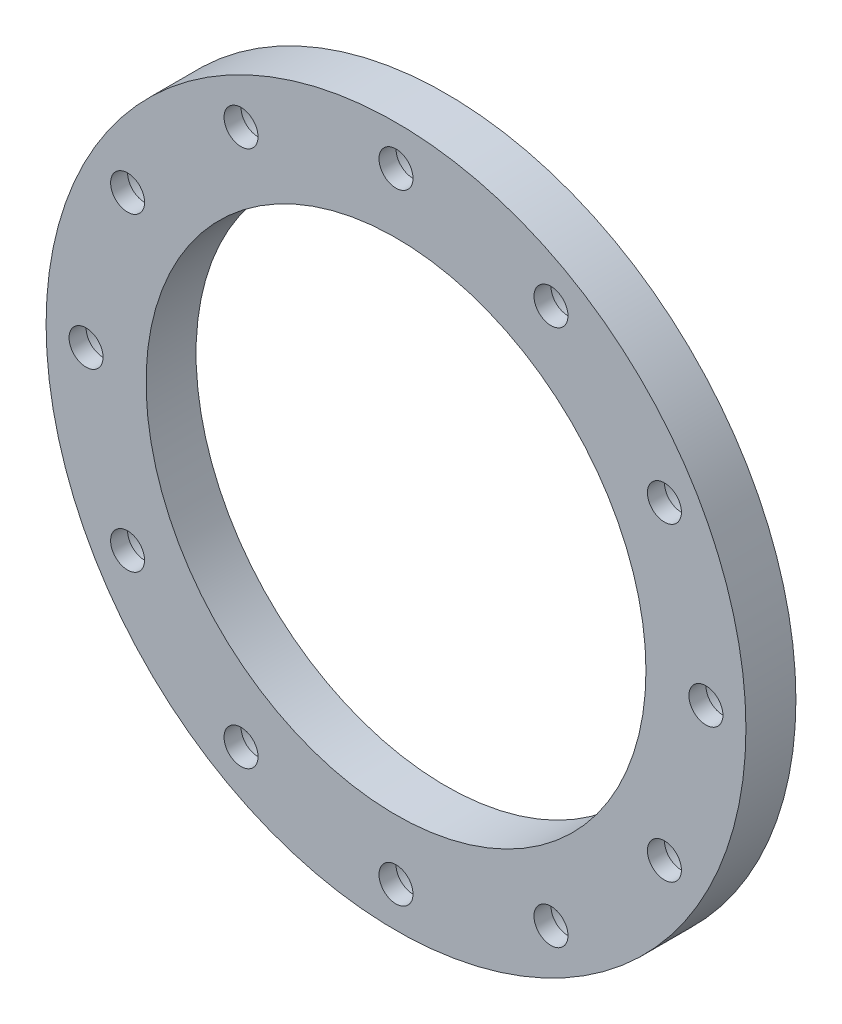
ISO-10303-21;
HEADER;
FILE_DESCRIPTION(('STEP AP214'),'2;1');
FILE_NAME('part.step','',(''),(''),'','','');
FILE_SCHEMA(('AUTOMOTIVE_DESIGN { 1 0 10303 214 1 1 1 1 }'));
ENDSEC;
DATA;
#1=APPLICATION_CONTEXT('core data for automotive mechanical design processes');
#2=APPLICATION_PROTOCOL_DEFINITION('international standard','automotive_design',2000,#1);
#3=PRODUCT_CONTEXT('',#1,'mechanical');
#4=PRODUCT('Part','Part','',(#3));
#5=PRODUCT_RELATED_PRODUCT_CATEGORY('part','',(#4));
#6=PRODUCT_DEFINITION_FORMATION('','',#4);
#7=PRODUCT_DEFINITION_CONTEXT('part definition',#1,'design');
#8=PRODUCT_DEFINITION('design','',#6,#7);
#9=PRODUCT_DEFINITION_SHAPE('','',#8);
#10=(LENGTH_UNIT() NAMED_UNIT(*) SI_UNIT(.MILLI.,.METRE.));
#11=(NAMED_UNIT(*) PLANE_ANGLE_UNIT() SI_UNIT($,.RADIAN.));
#12=(NAMED_UNIT(*) SI_UNIT($,.STERADIAN.) SOLID_ANGLE_UNIT());
#13=UNCERTAINTY_MEASURE_WITH_UNIT(LENGTH_MEASURE(1.E-05),#10,'distance_accuracy_value','');
#14=(GEOMETRIC_REPRESENTATION_CONTEXT(3) GLOBAL_UNCERTAINTY_ASSIGNED_CONTEXT((#13)) GLOBAL_UNIT_ASSIGNED_CONTEXT((#10,
#11,#12)) REPRESENTATION_CONTEXT('',''));
#15=CARTESIAN_POINT('',(0.,0.,0.));
#16=DIRECTION('',(0.,0.,1.));
#17=DIRECTION('',(1.,0.,0.));
#18=AXIS2_PLACEMENT_3D('',#15,#16,#17);
#19=CARTESIAN_POINT('',(-26.8467875173163,-15.5000000000008,-0.00100000000000013));
#20=DIRECTION('',(0.,0.,1.));
#21=DIRECTION('',(1.,0.,0.));
#22=AXIS2_PLACEMENT_3D('',#19,#20,#21);
#23=CYLINDRICAL_SURFACE('',#22,1.70000000000176);
#24=CARTESIAN_POINT('',(-26.8467875173163,-15.5000000000008,5.));
#25=DIRECTION('',(0.,0.,1.));
#26=DIRECTION('',(1.,0.,0.));
#27=AXIS2_PLACEMENT_3D('',#24,#25,#26);
#28=CIRCLE('',#27,1.70000000000176);
#29=CARTESIAN_POINT('',(-25.1467875173145,-15.5000000000008,5.));
#30=VERTEX_POINT('',#29);
#31=EDGE_CURVE('E111',#30,#30,#28,.T.);
#32=ORIENTED_EDGE('',*,*,#31,.T.);
#33=EDGE_LOOP('',(#32));
#34=FACE_BOUND('',#33,.T.);
#35=CARTESIAN_POINT('',(-26.8467875173163,-15.5000000000008,3.3));
#36=DIRECTION('',(0.,0.,-1.));
#37=DIRECTION('',(-1.,0.,0.));
#38=AXIS2_PLACEMENT_3D('',#35,#36,#37);
#39=CIRCLE('',#38,1.70000000000176);
#40=CARTESIAN_POINT('',(-28.546787517318,-15.5000000000008,3.3));
#41=VERTEX_POINT('',#40);
#42=EDGE_CURVE('E38',#41,#41,#39,.F.);
#43=ORIENTED_EDGE('',*,*,#42,.F.);
#44=EDGE_LOOP('',(#43));
#45=FACE_BOUND('',#44,.T.);
#46=ADVANCED_FACE('F34',(#34,#45),#23,.F.);
#47=CARTESIAN_POINT('',(-15.4999999999984,-26.846787517318,-0.00100000000000013));
#48=DIRECTION('',(0.,0.,1.));
#49=DIRECTION('',(1.,0.,0.));
#50=AXIS2_PLACEMENT_3D('',#47,#48,#49);
#51=CYLINDRICAL_SURFACE('',#50,1.70000000000194);
#52=CARTESIAN_POINT('',(-15.4999999999984,-26.846787517318,5.));
#53=DIRECTION('',(0.,0.,1.));
#54=DIRECTION('',(1.,0.,0.));
#55=AXIS2_PLACEMENT_3D('',#52,#53,#54);
#56=CIRCLE('',#55,1.70000000000194);
#57=CARTESIAN_POINT('',(-13.7999999999964,-26.846787517318,5.));
#58=VERTEX_POINT('',#57);
#59=EDGE_CURVE('E124',#58,#58,#56,.T.);
#60=ORIENTED_EDGE('',*,*,#59,.T.);
#61=EDGE_LOOP('',(#60));
#62=FACE_BOUND('',#61,.T.);
#63=CARTESIAN_POINT('',(-15.4999999999984,-26.846787517318,3.3));
#64=DIRECTION('',(0.,0.,-1.));
#65=DIRECTION('',(-1.,0.,0.));
#66=AXIS2_PLACEMENT_3D('',#63,#64,#65);
#67=CIRCLE('',#66,1.70000000000194);
#68=CARTESIAN_POINT('',(-17.2000000000003,-26.846787517318,3.3));
#69=VERTEX_POINT('',#68);
#70=EDGE_CURVE('E89',#69,#69,#67,.F.);
#71=ORIENTED_EDGE('',*,*,#70,.F.);
#72=EDGE_LOOP('',(#71));
#73=FACE_BOUND('',#72,.T.);
#74=ADVANCED_FACE('F176',(#62,#73),#51,.F.);
#75=CARTESIAN_POINT('',(1.75416197269352E-12,-31.,-0.00100000000000013));
#76=DIRECTION('',(0.,0.,1.));
#77=DIRECTION('',(1.,0.,0.));
#78=AXIS2_PLACEMENT_3D('',#75,#76,#77);
#79=CYLINDRICAL_SURFACE('',#78,1.70000000000188);
#80=CARTESIAN_POINT('',(1.75416197269352E-12,-31.,5.));
#81=DIRECTION('',(0.,0.,1.));
#82=DIRECTION('',(1.,0.,0.));
#83=AXIS2_PLACEMENT_3D('',#80,#81,#82);
#84=CIRCLE('',#83,1.70000000000188);
#85=CARTESIAN_POINT('',(1.70000000000364,-31.,5.));
#86=VERTEX_POINT('',#85);
#87=EDGE_CURVE('E121',#86,#86,#84,.T.);
#88=ORIENTED_EDGE('',*,*,#87,.T.);
#89=EDGE_LOOP('',(#88));
#90=FACE_BOUND('',#89,.T.);
#91=CARTESIAN_POINT('',(1.75416197269352E-12,-31.,3.3));
#92=DIRECTION('',(0.,0.,-1.));
#93=DIRECTION('',(-1.,0.,0.));
#94=AXIS2_PLACEMENT_3D('',#91,#92,#93);
#95=CIRCLE('',#94,1.70000000000188);
#96=CARTESIAN_POINT('',(-1.70000000000013,-31.,3.3));
#97=VERTEX_POINT('',#96);
#98=EDGE_CURVE('E87',#97,#97,#95,.F.);
#99=ORIENTED_EDGE('',*,*,#98,.F.);
#100=EDGE_LOOP('',(#99));
#101=FACE_BOUND('',#100,.T.);
#102=ADVANCED_FACE('F182',(#90,#101),#79,.F.);
#103=CARTESIAN_POINT('',(15.5000000000016,-26.8467875173172,-0.00100000000000013));
#104=DIRECTION('',(0.,0.,1.));
#105=DIRECTION('',(1.,0.,0.));
#106=AXIS2_PLACEMENT_3D('',#103,#104,#105);
#107=CYLINDRICAL_SURFACE('',#106,1.70000000000162);
#108=CARTESIAN_POINT('',(15.5000000000016,-26.8467875173172,5.));
#109=DIRECTION('',(0.,0.,1.));
#110=DIRECTION('',(1.,0.,0.));
#111=AXIS2_PLACEMENT_3D('',#108,#109,#110);
#112=CIRCLE('',#111,1.70000000000162);
#113=CARTESIAN_POINT('',(17.2000000000033,-26.8467875173172,5.));
#114=VERTEX_POINT('',#113);
#115=EDGE_CURVE('E117',#114,#114,#112,.T.);
#116=ORIENTED_EDGE('',*,*,#115,.T.);
#117=EDGE_LOOP('',(#116));
#118=FACE_BOUND('',#117,.T.);
#119=CARTESIAN_POINT('',(15.5000000000016,-26.8467875173172,3.3));
#120=DIRECTION('',(0.,0.,-1.));
#121=DIRECTION('',(-1.,0.,0.));
#122=AXIS2_PLACEMENT_3D('',#119,#120,#121);
#123=CIRCLE('',#122,1.70000000000162);
#124=CARTESIAN_POINT('',(13.8,-26.8467875173172,3.3));
#125=VERTEX_POINT('',#124);
#126=EDGE_CURVE('E84',#125,#125,#123,.F.);
#127=ORIENTED_EDGE('',*,*,#126,.F.);
#128=EDGE_LOOP('',(#127));
#129=FACE_BOUND('',#128,.T.);
#130=ADVANCED_FACE('F202',(#118,#129),#107,.F.);
#131=CARTESIAN_POINT('',(26.8467875173189,-15.4999999999992,-0.00100000000000013));
#132=DIRECTION('',(0.,0.,1.));
#133=DIRECTION('',(1.,0.,0.));
#134=AXIS2_PLACEMENT_3D('',#131,#132,#133);
#135=CYLINDRICAL_SURFACE('',#134,1.70000000000118);
#136=CARTESIAN_POINT('',(26.8467875173189,-15.4999999999992,5.));
#137=DIRECTION('',(0.,0.,1.));
#138=DIRECTION('',(1.,0.,0.));
#139=AXIS2_PLACEMENT_3D('',#136,#137,#138);
#140=CIRCLE('',#139,1.70000000000118);
#141=CARTESIAN_POINT('',(28.5467875173201,-15.4999999999992,5.));
#142=VERTEX_POINT('',#141);
#143=EDGE_CURVE('E120',#142,#142,#140,.T.);
#144=ORIENTED_EDGE('',*,*,#143,.T.);
#145=EDGE_LOOP('',(#144));
#146=FACE_BOUND('',#145,.T.);
#147=CARTESIAN_POINT('',(26.8467875173189,-15.4999999999992,3.3));
#148=DIRECTION('',(0.,0.,-1.));
#149=DIRECTION('',(-1.,0.,0.));
#150=AXIS2_PLACEMENT_3D('',#147,#148,#149);
#151=CIRCLE('',#150,1.70000000000118);
#152=CARTESIAN_POINT('',(25.1467875173177,-15.4999999999992,3.3));
#153=VERTEX_POINT('',#152);
#154=EDGE_CURVE('E81',#153,#153,#151,.F.);
#155=ORIENTED_EDGE('',*,*,#154,.F.);
#156=EDGE_LOOP('',(#155));
#157=FACE_BOUND('',#156,.T.);
#158=ADVANCED_FACE('F139',(#146,#157),#135,.F.);
#159=CARTESIAN_POINT('',(31.0000000000009,8.77080986346759E-13,-0.00100000000000013));
#160=DIRECTION('',(0.,0.,1.));
#161=DIRECTION('',(1.,0.,0.));
#162=AXIS2_PLACEMENT_3D('',#159,#160,#161);
#163=CYLINDRICAL_SURFACE('',#162,1.70000000000069);
#164=CARTESIAN_POINT('',(31.0000000000009,8.77080986346759E-13,5.));
#165=DIRECTION('',(0.,0.,1.));
#166=DIRECTION('',(1.,0.,0.));
#167=AXIS2_PLACEMENT_3D('',#164,#165,#166);
#168=CIRCLE('',#167,1.70000000000069);
#169=CARTESIAN_POINT('',(32.7000000000016,8.77080986346759E-13,5.));
#170=VERTEX_POINT('',#169);
#171=EDGE_CURVE('E134',#170,#170,#168,.T.);
#172=ORIENTED_EDGE('',*,*,#171,.T.);
#173=EDGE_LOOP('',(#172));
#174=FACE_BOUND('',#173,.T.);
#175=CARTESIAN_POINT('',(31.0000000000009,8.77080986346759E-13,3.3));
#176=DIRECTION('',(0.,0.,-1.));
#177=DIRECTION('',(-1.,0.,0.));
#178=AXIS2_PLACEMENT_3D('',#175,#176,#177);
#179=CIRCLE('',#178,1.70000000000069);
#180=CARTESIAN_POINT('',(29.3000000000002,8.77080986346759E-13,3.3));
#181=VERTEX_POINT('',#180);
#182=EDGE_CURVE('E78',#181,#181,#179,.F.);
#183=ORIENTED_EDGE('',*,*,#182,.F.);
#184=EDGE_LOOP('',(#183));
#185=FACE_BOUND('',#184,.T.);
#186=ADVANCED_FACE('F196',(#174,#185),#163,.F.);
#187=CARTESIAN_POINT('',(26.846787517318,15.5000000000008,-0.00100000000000013));
#188=DIRECTION('',(0.,0.,1.));
#189=DIRECTION('',(1.,0.,0.));
#190=AXIS2_PLACEMENT_3D('',#187,#188,#189);
#191=CYLINDRICAL_SURFACE('',#190,1.70000000000027);
#192=CARTESIAN_POINT('',(26.846787517318,15.5000000000008,5.));
#193=DIRECTION('',(0.,0.,1.));
#194=DIRECTION('',(1.,0.,0.));
#195=AXIS2_PLACEMENT_3D('',#192,#193,#194);
#196=CIRCLE('',#195,1.70000000000027);
#197=CARTESIAN_POINT('',(28.5467875173183,15.5000000000008,5.));
#198=VERTEX_POINT('',#197);
#199=EDGE_CURVE('E131',#198,#198,#196,.T.);
#200=ORIENTED_EDGE('',*,*,#199,.T.);
#201=EDGE_LOOP('',(#200));
#202=FACE_BOUND('',#201,.T.);
#203=CARTESIAN_POINT('',(26.846787517318,15.5000000000008,3.3));
#204=DIRECTION('',(0.,0.,-1.));
#205=DIRECTION('',(-1.,0.,0.));
#206=AXIS2_PLACEMENT_3D('',#203,#204,#205);
#207=CIRCLE('',#206,1.70000000000027);
#208=CARTESIAN_POINT('',(25.1467875173178,15.5000000000008,3.3));
#209=VERTEX_POINT('',#208);
#210=EDGE_CURVE('E75',#209,#209,#207,.F.);
#211=ORIENTED_EDGE('',*,*,#210,.F.);
#212=EDGE_LOOP('',(#211));
#213=FACE_BOUND('',#212,.T.);
#214=ADVANCED_FACE('F192',(#202,#213),#191,.F.);
#215=CARTESIAN_POINT('',(15.5,26.8467875173176,-0.00100000000000013));
#216=DIRECTION('',(0.,0.,1.));
#217=DIRECTION('',(1.,0.,0.));
#218=AXIS2_PLACEMENT_3D('',#215,#216,#217);
#219=CYLINDRICAL_SURFACE('',#218,1.7);
#220=CARTESIAN_POINT('',(15.5,26.8467875173176,5.));
#221=DIRECTION('',(0.,0.,1.));
#222=DIRECTION('',(1.,0.,0.));
#223=AXIS2_PLACEMENT_3D('',#220,#221,#222);
#224=CIRCLE('',#223,1.7);
#225=CARTESIAN_POINT('',(17.2,26.8467875173176,5.));
#226=VERTEX_POINT('',#225);
#227=EDGE_CURVE('E107',#226,#226,#224,.T.);
#228=ORIENTED_EDGE('',*,*,#227,.T.);
#229=EDGE_LOOP('',(#228));
#230=FACE_BOUND('',#229,.T.);
#231=CARTESIAN_POINT('',(15.5,26.8467875173176,3.3));
#232=DIRECTION('',(0.,0.,-1.));
#233=DIRECTION('',(-1.,0.,0.));
#234=AXIS2_PLACEMENT_3D('',#231,#232,#233);
#235=CIRCLE('',#234,1.7);
#236=CARTESIAN_POINT('',(13.8,26.8467875173176,3.3));
#237=VERTEX_POINT('',#236);
#238=EDGE_CURVE('E72',#237,#237,#235,.F.);
#239=ORIENTED_EDGE('',*,*,#238,.F.);
#240=EDGE_LOOP('',(#239));
#241=FACE_BOUND('',#240,.T.);
#242=ADVANCED_FACE('F188',(#230,#241),#219,.F.);
#243=CARTESIAN_POINT('',(-30.9999999999991,-8.80877391424116E-13,-0.00100000000000013));
#244=DIRECTION('',(0.,0.,1.));
#245=DIRECTION('',(1.,0.,0.));
#246=AXIS2_PLACEMENT_3D('',#243,#244,#245);
#247=CYLINDRICAL_SURFACE('',#246,1.70000000000141);
#248=CARTESIAN_POINT('',(-30.9999999999991,-8.80877391424116E-13,5.));
#249=DIRECTION('',(0.,0.,1.));
#250=DIRECTION('',(1.,0.,0.));
#251=AXIS2_PLACEMENT_3D('',#248,#249,#250);
#252=CIRCLE('',#251,1.70000000000141);
#253=CARTESIAN_POINT('',(-29.2999999999977,-8.80877391424116E-13,5.));
#254=VERTEX_POINT('',#253);
#255=EDGE_CURVE('E108',#254,#254,#252,.T.);
#256=ORIENTED_EDGE('',*,*,#255,.T.);
#257=EDGE_LOOP('',(#256));
#258=FACE_BOUND('',#257,.T.);
#259=CARTESIAN_POINT('',(-30.9999999999991,-8.80877391424116E-13,3.3));
#260=DIRECTION('',(0.,0.,-1.));
#261=DIRECTION('',(-1.,0.,0.));
#262=AXIS2_PLACEMENT_3D('',#259,#260,#261);
#263=CIRCLE('',#262,1.70000000000141);
#264=CARTESIAN_POINT('',(-32.7000000000005,-8.80877391424116E-13,3.3));
#265=VERTEX_POINT('',#264);
#266=EDGE_CURVE('E69',#265,#265,#263,.F.);
#267=ORIENTED_EDGE('',*,*,#266,.F.);
#268=EDGE_LOOP('',(#267));
#269=FACE_BOUND('',#268,.T.);
#270=ADVANCED_FACE('F191',(#258,#269),#247,.F.);
#271=CARTESIAN_POINT('',(-26.8467875173172,15.4999999999992,-0.00100000000000013));
#272=DIRECTION('',(0.,0.,1.));
#273=DIRECTION('',(1.,0.,0.));
#274=AXIS2_PLACEMENT_3D('',#271,#272,#273);
#275=CYLINDRICAL_SURFACE('',#274,1.70000000000101);
#276=CARTESIAN_POINT('',(-26.8467875173172,15.4999999999992,5.));
#277=DIRECTION('',(0.,0.,1.));
#278=DIRECTION('',(1.,0.,0.));
#279=AXIS2_PLACEMENT_3D('',#276,#277,#278);
#280=CIRCLE('',#279,1.70000000000101);
#281=CARTESIAN_POINT('',(-25.1467875173162,15.4999999999992,5.));
#282=VERTEX_POINT('',#281);
#283=EDGE_CURVE('E112',#282,#282,#280,.T.);
#284=ORIENTED_EDGE('',*,*,#283,.T.);
#285=EDGE_LOOP('',(#284));
#286=FACE_BOUND('',#285,.T.);
#287=CARTESIAN_POINT('',(-26.8467875173172,15.4999999999992,3.3));
#288=DIRECTION('',(0.,0.,-1.));
#289=DIRECTION('',(-1.,0.,0.));
#290=AXIS2_PLACEMENT_3D('',#287,#288,#289);
#291=CIRCLE('',#290,1.70000000000101);
#292=CARTESIAN_POINT('',(-28.5467875173182,15.4999999999992,3.3));
#293=VERTEX_POINT('',#292);
#294=EDGE_CURVE('E65',#293,#293,#291,.F.);
#295=ORIENTED_EDGE('',*,*,#294,.F.);
#296=EDGE_LOOP('',(#295));
#297=FACE_BOUND('',#296,.T.);
#298=ADVANCED_FACE('F217',(#286,#297),#275,.F.);
#299=CARTESIAN_POINT('',(-15.4999999999997,26.8467875173178,-0.00100000000000013));
#300=DIRECTION('',(0.,0.,1.));
#301=DIRECTION('',(1.,0.,0.));
#302=AXIS2_PLACEMENT_3D('',#299,#300,#301);
#303=CYLINDRICAL_SURFACE('',#302,1.7);
#304=CARTESIAN_POINT('',(-15.4999999999997,26.8467875173178,5.));
#305=DIRECTION('',(0.,0.,1.));
#306=DIRECTION('',(1.,0.,0.));
#307=AXIS2_PLACEMENT_3D('',#304,#305,#306);
#308=CIRCLE('',#307,1.7);
#309=CARTESIAN_POINT('',(-13.7999999999997,26.8467875173178,5.));
#310=VERTEX_POINT('',#309);
#311=EDGE_CURVE('E60',#310,#310,#308,.T.);
#312=ORIENTED_EDGE('',*,*,#311,.T.);
#313=EDGE_LOOP('',(#312));
#314=FACE_BOUND('',#313,.T.);
#315=CARTESIAN_POINT('',(-15.4999999999997,26.8467875173178,3.3));
#316=DIRECTION('',(0.,0.,-1.));
#317=DIRECTION('',(-1.,0.,0.));
#318=AXIS2_PLACEMENT_3D('',#315,#316,#317);
#319=CIRCLE('',#318,1.7);
#320=CARTESIAN_POINT('',(-17.1999999999997,26.8467875173178,3.3));
#321=VERTEX_POINT('',#320);
#322=EDGE_CURVE('E62',#321,#321,#319,.F.);
#323=ORIENTED_EDGE('',*,*,#322,.F.);
#324=EDGE_LOOP('',(#323));
#325=FACE_BOUND('',#324,.T.);
#326=ADVANCED_FACE('F214',(#314,#325),#303,.F.);
#327=CARTESIAN_POINT('',(0.,31.,-0.00100000000000013));
#328=DIRECTION('',(0.,0.,1.));
#329=DIRECTION('',(1.,0.,0.));
#330=AXIS2_PLACEMENT_3D('',#327,#328,#329);
#331=CYLINDRICAL_SURFACE('',#330,1.7);
#332=CARTESIAN_POINT('',(0.,31.,5.));
#333=DIRECTION('',(0.,0.,1.));
#334=DIRECTION('',(1.,0.,0.));
#335=AXIS2_PLACEMENT_3D('',#332,#333,#334);
#336=CIRCLE('',#335,1.7);
#337=CARTESIAN_POINT('',(1.7,31.,5.));
#338=VERTEX_POINT('',#337);
#339=EDGE_CURVE('E54',#338,#338,#336,.T.);
#340=ORIENTED_EDGE('',*,*,#339,.T.);
#341=EDGE_LOOP('',(#340));
#342=FACE_BOUND('',#341,.T.);
#343=CARTESIAN_POINT('',(0.,31.,3.3));
#344=DIRECTION('',(0.,0.,-1.));
#345=DIRECTION('',(-1.,0.,0.));
#346=AXIS2_PLACEMENT_3D('',#343,#344,#345);
#347=CIRCLE('',#346,1.7);
#348=CARTESIAN_POINT('',(-1.7,31.,3.3));
#349=VERTEX_POINT('',#348);
#350=EDGE_CURVE('E57',#349,#349,#347,.F.);
#351=ORIENTED_EDGE('',*,*,#350,.F.);
#352=EDGE_LOOP('',(#351));
#353=FACE_BOUND('',#352,.T.);
#354=ADVANCED_FACE('F162',(#342,#353),#331,.F.);
#355=CARTESIAN_POINT('',(0.,0.,5.));
#356=DIRECTION('',(0.,0.,-1.));
#357=DIRECTION('',(-1.,0.,0.));
#358=AXIS2_PLACEMENT_3D('',#355,#356,#357);
#359=CYLINDRICAL_SURFACE('',#358,35.);
#360=CARTESIAN_POINT('',(0.,0.,5.));
#361=DIRECTION('',(0.,0.,1.));
#362=DIRECTION('',(1.,0.,0.));
#363=AXIS2_PLACEMENT_3D('',#360,#361,#362);
#364=CIRCLE('',#363,35.);
#365=CARTESIAN_POINT('',(35.,0.,5.));
#366=VERTEX_POINT('',#365);
#367=EDGE_CURVE('E42',#366,#366,#364,.T.);
#368=ORIENTED_EDGE('',*,*,#367,.F.);
#369=EDGE_LOOP('',(#368));
#370=FACE_BOUND('',#369,.T.);
#371=CARTESIAN_POINT('',(0.,0.,0.));
#372=DIRECTION('',(0.,0.,1.));
#373=DIRECTION('',(1.,0.,0.));
#374=AXIS2_PLACEMENT_3D('',#371,#372,#373);
#375=CIRCLE('',#374,35.);
#376=CARTESIAN_POINT('',(35.,0.,0.));
#377=VERTEX_POINT('',#376);
#378=EDGE_CURVE('E51',#377,#377,#375,.T.);
#379=ORIENTED_EDGE('',*,*,#378,.T.);
#380=EDGE_LOOP('',(#379));
#381=FACE_BOUND('',#380,.T.);
#382=ADVANCED_FACE('F36',(#370,#381),#359,.T.);
#383=CARTESIAN_POINT('',(0.,0.,5.));
#384=DIRECTION('',(0.,0.,-1.));
#385=DIRECTION('',(-1.,0.,0.));
#386=AXIS2_PLACEMENT_3D('',#383,#384,#385);
#387=CYLINDRICAL_SURFACE('',#386,25.);
#388=CARTESIAN_POINT('',(0.,0.,5.));
#389=DIRECTION('',(0.,0.,1.));
#390=DIRECTION('',(1.,0.,0.));
#391=AXIS2_PLACEMENT_3D('',#388,#389,#390);
#392=CIRCLE('',#391,25.);
#393=CARTESIAN_POINT('',(25.,0.,5.));
#394=VERTEX_POINT('',#393);
#395=EDGE_CURVE('E10',#394,#394,#392,.T.);
#396=ORIENTED_EDGE('',*,*,#395,.T.);
#397=EDGE_LOOP('',(#396));
#398=FACE_BOUND('',#397,.T.);
#399=CARTESIAN_POINT('',(0.,0.,0.));
#400=DIRECTION('',(0.,0.,1.));
#401=DIRECTION('',(1.,0.,0.));
#402=AXIS2_PLACEMENT_3D('',#399,#400,#401);
#403=CIRCLE('',#402,25.);
#404=CARTESIAN_POINT('',(25.,0.,0.));
#405=VERTEX_POINT('',#404);
#406=EDGE_CURVE('E47',#405,#405,#403,.T.);
#407=ORIENTED_EDGE('',*,*,#406,.F.);
#408=EDGE_LOOP('',(#407));
#409=FACE_BOUND('',#408,.T.);
#410=ADVANCED_FACE('F146',(#398,#409),#387,.F.);
#411=CARTESIAN_POINT('',(0.,0.,5.));
#412=DIRECTION('',(0.,0.,1.));
#413=DIRECTION('',(1.,0.,0.));
#414=AXIS2_PLACEMENT_3D('',#411,#412,#413);
#415=PLANE('',#414);
#416=ORIENTED_EDGE('',*,*,#339,.F.);
#417=EDGE_LOOP('',(#416));
#418=FACE_BOUND('',#417,.T.);
#419=ORIENTED_EDGE('',*,*,#311,.F.);
#420=EDGE_LOOP('',(#419));
#421=FACE_BOUND('',#420,.T.);
#422=ORIENTED_EDGE('',*,*,#283,.F.);
#423=EDGE_LOOP('',(#422));
#424=FACE_BOUND('',#423,.T.);
#425=ORIENTED_EDGE('',*,*,#255,.F.);
#426=EDGE_LOOP('',(#425));
#427=FACE_BOUND('',#426,.T.);
#428=ORIENTED_EDGE('',*,*,#227,.F.);
#429=EDGE_LOOP('',(#428));
#430=FACE_BOUND('',#429,.T.);
#431=ORIENTED_EDGE('',*,*,#199,.F.);
#432=EDGE_LOOP('',(#431));
#433=FACE_BOUND('',#432,.T.);
#434=ORIENTED_EDGE('',*,*,#171,.F.);
#435=EDGE_LOOP('',(#434));
#436=FACE_BOUND('',#435,.T.);
#437=ORIENTED_EDGE('',*,*,#143,.F.);
#438=EDGE_LOOP('',(#437));
#439=FACE_BOUND('',#438,.T.);
#440=ORIENTED_EDGE('',*,*,#115,.F.);
#441=EDGE_LOOP('',(#440));
#442=FACE_BOUND('',#441,.T.);
#443=ORIENTED_EDGE('',*,*,#87,.F.);
#444=EDGE_LOOP('',(#443));
#445=FACE_BOUND('',#444,.T.);
#446=ORIENTED_EDGE('',*,*,#59,.F.);
#447=EDGE_LOOP('',(#446));
#448=FACE_BOUND('',#447,.T.);
#449=ORIENTED_EDGE('',*,*,#31,.F.);
#450=EDGE_LOOP('',(#449));
#451=FACE_BOUND('',#450,.T.);
#452=ORIENTED_EDGE('',*,*,#367,.T.);
#453=EDGE_LOOP('',(#452));
#454=FACE_BOUND('',#453,.T.);
#455=ORIENTED_EDGE('',*,*,#395,.F.);
#456=EDGE_LOOP('',(#455));
#457=FACE_BOUND('',#456,.T.);
#458=ADVANCED_FACE('F142',(#418,#421,#424,#427,#430,#433,#436,#439,#442,#445,#448,#451,#454,
#457),#415,.T.);
#459=CARTESIAN_POINT('',(0.,0.,0.));
#460=DIRECTION('',(0.,0.,1.));
#461=DIRECTION('',(1.,0.,0.));
#462=AXIS2_PLACEMENT_3D('',#459,#460,#461);
#463=PLANE('',#462);
#464=CARTESIAN_POINT('',(-26.8467875173176,15.4999999999999,0.));
#465=DIRECTION('',(0.,0.,-1.));
#466=DIRECTION('',(-0.499999999999998,-0.86602540378444,0.));
#467=AXIS2_PLACEMENT_3D('',#464,#465,#466);
#468=CIRCLE('',#467,3.3);
#469=CARTESIAN_POINT('',(-28.4967875173176,12.6421161675113,0.));
#470=VERTEX_POINT('',#469);
#471=EDGE_CURVE('E349',#470,#470,#468,.T.);
#472=ORIENTED_EDGE('',*,*,#471,.F.);
#473=EDGE_LOOP('',(#472));
#474=FACE_BOUND('',#473,.T.);
#475=CARTESIAN_POINT('',(-31.,-1.08431522422545E-13,0.));
#476=DIRECTION('',(0.,0.,-1.));
#477=DIRECTION('',(0.,-1.,0.));
#478=AXIS2_PLACEMENT_3D('',#475,#476,#477);
#479=CIRCLE('',#478,3.3);
#480=CARTESIAN_POINT('',(-31.,-3.30000000000011,0.));
#481=VERTEX_POINT('',#480);
#482=EDGE_CURVE('E355',#481,#481,#479,.T.);
#483=ORIENTED_EDGE('',*,*,#482,.F.);
#484=EDGE_LOOP('',(#483));
#485=FACE_BOUND('',#484,.T.);
#486=CARTESIAN_POINT('',(-26.8467875173175,-15.5000000000001,0.));
#487=DIRECTION('',(0.,0.,-1.));
#488=DIRECTION('',(0.500000000000004,-0.866025403784436,0.));
#489=AXIS2_PLACEMENT_3D('',#486,#487,#488);
#490=CIRCLE('',#489,3.3);
#491=CARTESIAN_POINT('',(-25.1967875173175,-18.3578838324888,0.));
#492=VERTEX_POINT('',#491);
#493=EDGE_CURVE('E361',#492,#492,#490,.T.);
#494=ORIENTED_EDGE('',*,*,#493,.F.);
#495=EDGE_LOOP('',(#494));
#496=FACE_BOUND('',#495,.T.);
#497=CARTESIAN_POINT('',(-15.4999999999998,-26.8467875173177,0.));
#498=DIRECTION('',(0.,0.,-1.));
#499=DIRECTION('',(0.866025403784442,-0.499999999999995,0.));
#500=AXIS2_PLACEMENT_3D('',#497,#498,#499);
#501=CIRCLE('',#500,3.3);
#502=CARTESIAN_POINT('',(-12.6421161675112,-28.4967875173177,0.));
#503=VERTEX_POINT('',#502);
#504=EDGE_CURVE('E367',#503,#503,#501,.T.);
#505=ORIENTED_EDGE('',*,*,#504,.F.);
#506=EDGE_LOOP('',(#505));
#507=FACE_BOUND('',#506,.T.);
#508=CARTESIAN_POINT('',(0.,-31.,0.));
#509=DIRECTION('',(0.,0.,-1.));
#510=DIRECTION('',(1.,0.,0.));
#511=AXIS2_PLACEMENT_3D('',#508,#509,#510);
#512=CIRCLE('',#511,3.3);
#513=CARTESIAN_POINT('',(3.3,-31.,0.));
#514=VERTEX_POINT('',#513);
#515=EDGE_CURVE('E373',#514,#514,#512,.T.);
#516=ORIENTED_EDGE('',*,*,#515,.F.);
#517=EDGE_LOOP('',(#516));
#518=FACE_BOUND('',#517,.T.);
#519=CARTESIAN_POINT('',(15.5000000000002,-26.8467875173175,0.));
#520=DIRECTION('',(0.,0.,-1.));
#521=DIRECTION('',(0.866025403784435,0.500000000000007,0.));
#522=AXIS2_PLACEMENT_3D('',#519,#520,#521);
#523=CIRCLE('',#522,3.3);
#524=CARTESIAN_POINT('',(18.3578838324889,-25.1967875173174,0.));
#525=VERTEX_POINT('',#524);
#526=EDGE_CURVE('E379',#525,#525,#523,.T.);
#527=ORIENTED_EDGE('',*,*,#526,.F.);
#528=EDGE_LOOP('',(#527));
#529=FACE_BOUND('',#528,.T.);
#530=CARTESIAN_POINT('',(26.8467875173177,-15.4999999999997,0.));
#531=DIRECTION('',(0.,0.,-1.));
#532=DIRECTION('',(0.499999999999992,0.866025403784443,0.));
#533=AXIS2_PLACEMENT_3D('',#530,#531,#532);
#534=CIRCLE('',#533,3.3);
#535=CARTESIAN_POINT('',(28.4967875173177,-12.6421161675111,0.));
#536=VERTEX_POINT('',#535);
#537=EDGE_CURVE('E385',#536,#536,#534,.T.);
#538=ORIENTED_EDGE('',*,*,#537,.F.);
#539=EDGE_LOOP('',(#538));
#540=FACE_BOUND('',#539,.T.);
#541=CARTESIAN_POINT('',(31.,3.2490336543082E-13,0.));
#542=DIRECTION('',(0.,0.,-1.));
#543=DIRECTION('',(0.,1.,0.));
#544=AXIS2_PLACEMENT_3D('',#541,#542,#543);
#545=CIRCLE('',#544,3.3);
#546=CARTESIAN_POINT('',(31.,3.30000000000032,0.));
#547=VERTEX_POINT('',#546);
#548=EDGE_CURVE('E330',#547,#547,#545,.T.);
#549=ORIENTED_EDGE('',*,*,#548,.F.);
#550=EDGE_LOOP('',(#549));
#551=FACE_BOUND('',#550,.T.);
#552=CARTESIAN_POINT('',(26.8467875173174,15.5000000000003,0.));
#553=DIRECTION('',(0.,0.,-1.));
#554=DIRECTION('',(-0.50000000000001,0.866025403784433,0.));
#555=AXIS2_PLACEMENT_3D('',#552,#553,#554);
#556=CIRCLE('',#555,3.3);
#557=CARTESIAN_POINT('',(25.1967875173174,18.3578838324889,0.));
#558=VERTEX_POINT('',#557);
#559=EDGE_CURVE('E331',#558,#558,#556,.T.);
#560=ORIENTED_EDGE('',*,*,#559,.F.);
#561=EDGE_LOOP('',(#560));
#562=FACE_BOUND('',#561,.T.);
#563=CARTESIAN_POINT('',(15.4999999999997,26.8467875173178,0.));
#564=DIRECTION('',(0.,0.,-1.));
#565=DIRECTION('',(-0.866025403784445,0.499999999999989,0.));
#566=AXIS2_PLACEMENT_3D('',#563,#564,#565);
#567=CIRCLE('',#566,3.3);
#568=CARTESIAN_POINT('',(12.642116167511,28.4967875173178,0.));
#569=VERTEX_POINT('',#568);
#570=EDGE_CURVE('E342',#569,#569,#567,.T.);
#571=ORIENTED_EDGE('',*,*,#570,.F.);
#572=EDGE_LOOP('',(#571));
#573=FACE_BOUND('',#572,.T.);
#574=CARTESIAN_POINT('',(-15.5,26.8467875173176,0.));
#575=DIRECTION('',(0.,0.,-1.));
#576=DIRECTION('',(-0.866025403784438,-0.500000000000001,0.));
#577=AXIS2_PLACEMENT_3D('',#574,#575,#576);
#578=CIRCLE('',#577,3.3);
#579=CARTESIAN_POINT('',(-18.3578838324887,25.1967875173176,0.));
#580=VERTEX_POINT('',#579);
#581=EDGE_CURVE('E348',#580,#580,#578,.T.);
#582=ORIENTED_EDGE('',*,*,#581,.F.);
#583=EDGE_LOOP('',(#582));
#584=FACE_BOUND('',#583,.T.);
#585=CARTESIAN_POINT('',(0.,31.,0.));
#586=DIRECTION('',(0.,0.,-1.));
#587=DIRECTION('',(-1.,0.,0.));
#588=AXIS2_PLACEMENT_3D('',#585,#586,#587);
#589=CIRCLE('',#588,3.3);
#590=CARTESIAN_POINT('',(-3.3,31.,0.));
#591=VERTEX_POINT('',#590);
#592=EDGE_CURVE('E94',#591,#591,#589,.T.);
#593=ORIENTED_EDGE('',*,*,#592,.F.);
#594=EDGE_LOOP('',(#593));
#595=FACE_BOUND('',#594,.T.);
#596=ORIENTED_EDGE('',*,*,#378,.F.);
#597=EDGE_LOOP('',(#596));
#598=FACE_BOUND('',#597,.T.);
#599=ORIENTED_EDGE('',*,*,#406,.T.);
#600=EDGE_LOOP('',(#599));
#601=FACE_BOUND('',#600,.T.);
#602=ADVANCED_FACE('F145',(#474,#485,#496,#507,#518,#529,#540,#551,#562,#573,#584,#595,#598,
#601),#463,.F.);
#603=CARTESIAN_POINT('',(0.,31.,3.3));
#604=DIRECTION('',(0.,0.,-1.));
#605=DIRECTION('',(-1.,0.,0.));
#606=AXIS2_PLACEMENT_3D('',#603,#604,#605);
#607=PLANE('',#606);
#608=CARTESIAN_POINT('',(0.,31.,3.3));
#609=DIRECTION('',(0.,0.,-1.));
#610=DIRECTION('',(-1.,0.,0.));
#611=AXIS2_PLACEMENT_3D('',#608,#609,#610);
#612=CIRCLE('',#611,3.3);
#613=CARTESIAN_POINT('',(-3.3,31.,3.3));
#614=VERTEX_POINT('',#613);
#615=EDGE_CURVE('E61',#614,#614,#612,.T.);
#616=ORIENTED_EDGE('',*,*,#615,.T.);
#617=EDGE_LOOP('',(#616));
#618=FACE_BOUND('',#617,.T.);
#619=ORIENTED_EDGE('',*,*,#350,.T.);
#620=EDGE_LOOP('',(#619));
#621=FACE_BOUND('',#620,.T.);
#622=ADVANCED_FACE('F167',(#618,#621),#607,.T.);
#623=CARTESIAN_POINT('',(0.,31.,3.3));
#624=DIRECTION('',(0.,0.,-1.));
#625=DIRECTION('',(-1.,0.,0.));
#626=AXIS2_PLACEMENT_3D('',#623,#624,#625);
#627=CYLINDRICAL_SURFACE('',#626,3.3);
#628=ORIENTED_EDGE('',*,*,#615,.F.);
#629=EDGE_LOOP('',(#628));
#630=FACE_BOUND('',#629,.T.);
#631=ORIENTED_EDGE('',*,*,#592,.T.);
#632=EDGE_LOOP('',(#631));
#633=FACE_BOUND('',#632,.T.);
#634=ADVANCED_FACE('F228',(#630,#633),#627,.F.);
#635=CARTESIAN_POINT('',(-15.5,26.8467875173176,3.3));
#636=DIRECTION('',(0.,0.,-1.));
#637=DIRECTION('',(-0.866025403784438,-0.500000000000001,0.));
#638=AXIS2_PLACEMENT_3D('',#635,#636,#637);
#639=PLANE('',#638);
#640=CARTESIAN_POINT('',(-15.5,26.8467875173176,3.3));
#641=DIRECTION('',(0.,0.,-1.));
#642=DIRECTION('',(-0.866025403784438,-0.500000000000001,0.));
#643=AXIS2_PLACEMENT_3D('',#640,#641,#642);
#644=CIRCLE('',#643,3.3);
#645=CARTESIAN_POINT('',(-18.3578838324887,25.1967875173176,3.3));
#646=VERTEX_POINT('',#645);
#647=EDGE_CURVE('E66',#646,#646,#644,.T.);
#648=ORIENTED_EDGE('',*,*,#647,.T.);
#649=EDGE_LOOP('',(#648));
#650=FACE_BOUND('',#649,.T.);
#651=ORIENTED_EDGE('',*,*,#322,.T.);
#652=EDGE_LOOP('',(#651));
#653=FACE_BOUND('',#652,.T.);
#654=ADVANCED_FACE('F231',(#650,#653),#639,.T.);
#655=CARTESIAN_POINT('',(-15.5,26.8467875173176,3.3));
#656=DIRECTION('',(0.,0.,-1.));
#657=DIRECTION('',(-1.,0.,0.));
#658=AXIS2_PLACEMENT_3D('',#655,#656,#657);
#659=CYLINDRICAL_SURFACE('',#658,3.3);
#660=ORIENTED_EDGE('',*,*,#647,.F.);
#661=EDGE_LOOP('',(#660));
#662=FACE_BOUND('',#661,.T.);
#663=ORIENTED_EDGE('',*,*,#581,.T.);
#664=EDGE_LOOP('',(#663));
#665=FACE_BOUND('',#664,.T.);
#666=ADVANCED_FACE('F236',(#662,#665),#659,.F.);
#667=CARTESIAN_POINT('',(-26.8467875173176,15.4999999999999,3.3));
#668=DIRECTION('',(0.,0.,-1.));
#669=DIRECTION('',(-0.499999999999998,-0.86602540378444,0.));
#670=AXIS2_PLACEMENT_3D('',#667,#668,#669);
#671=PLANE('',#670);
#672=CARTESIAN_POINT('',(-26.8467875173176,15.4999999999999,3.3));
#673=DIRECTION('',(0.,0.,-1.));
#674=DIRECTION('',(-0.499999999999998,-0.86602540378444,0.));
#675=AXIS2_PLACEMENT_3D('',#672,#673,#674);
#676=CIRCLE('',#675,3.3);
#677=CARTESIAN_POINT('',(-28.4967875173176,12.6421161675113,3.3));
#678=VERTEX_POINT('',#677);
#679=EDGE_CURVE('E345',#678,#678,#676,.T.);
#680=ORIENTED_EDGE('',*,*,#679,.T.);
#681=EDGE_LOOP('',(#680));
#682=FACE_BOUND('',#681,.T.);
#683=ORIENTED_EDGE('',*,*,#294,.T.);
#684=EDGE_LOOP('',(#683));
#685=FACE_BOUND('',#684,.T.);
#686=ADVANCED_FACE('F239',(#682,#685),#671,.T.);
#687=CARTESIAN_POINT('',(-26.8467875173176,15.4999999999999,3.3));
#688=DIRECTION('',(0.,0.,-1.));
#689=DIRECTION('',(-1.,0.,0.));
#690=AXIS2_PLACEMENT_3D('',#687,#688,#689);
#691=CYLINDRICAL_SURFACE('',#690,3.3);
#692=ORIENTED_EDGE('',*,*,#679,.F.);
#693=EDGE_LOOP('',(#692));
#694=FACE_BOUND('',#693,.T.);
#695=ORIENTED_EDGE('',*,*,#471,.T.);
#696=EDGE_LOOP('',(#695));
#697=FACE_BOUND('',#696,.T.);
#698=ADVANCED_FACE('F301',(#694,#697),#691,.F.);
#699=CARTESIAN_POINT('',(-31.,-1.08431522422545E-13,3.3));
#700=DIRECTION('',(0.,0.,-1.));
#701=DIRECTION('',(0.,-1.,0.));
#702=AXIS2_PLACEMENT_3D('',#699,#700,#701);
#703=PLANE('',#702);
#704=CARTESIAN_POINT('',(-31.,-1.08431522422545E-13,3.3));
#705=DIRECTION('',(0.,0.,-1.));
#706=DIRECTION('',(0.,-1.,0.));
#707=AXIS2_PLACEMENT_3D('',#704,#705,#706);
#708=CIRCLE('',#707,3.3);
#709=CARTESIAN_POINT('',(-31.,-3.30000000000011,3.3));
#710=VERTEX_POINT('',#709);
#711=EDGE_CURVE('E352',#710,#710,#708,.T.);
#712=ORIENTED_EDGE('',*,*,#711,.T.);
#713=EDGE_LOOP('',(#712));
#714=FACE_BOUND('',#713,.T.);
#715=ORIENTED_EDGE('',*,*,#266,.T.);
#716=EDGE_LOOP('',(#715));
#717=FACE_BOUND('',#716,.T.);
#718=ADVANCED_FACE('F297',(#714,#717),#703,.T.);
#719=CARTESIAN_POINT('',(-31.,-1.08431522422545E-13,3.3));
#720=DIRECTION('',(0.,0.,-1.));
#721=DIRECTION('',(-1.,0.,0.));
#722=AXIS2_PLACEMENT_3D('',#719,#720,#721);
#723=CYLINDRICAL_SURFACE('',#722,3.3);
#724=ORIENTED_EDGE('',*,*,#711,.F.);
#725=EDGE_LOOP('',(#724));
#726=FACE_BOUND('',#725,.T.);
#727=ORIENTED_EDGE('',*,*,#482,.T.);
#728=EDGE_LOOP('',(#727));
#729=FACE_BOUND('',#728,.T.);
#730=ADVANCED_FACE('F293',(#726,#729),#723,.F.);
#731=CARTESIAN_POINT('',(15.4999999999997,26.8467875173178,3.3));
#732=DIRECTION('',(0.,0.,-1.));
#733=DIRECTION('',(-0.866025403784445,0.499999999999989,0.));
#734=AXIS2_PLACEMENT_3D('',#731,#732,#733);
#735=PLANE('',#734);
#736=CARTESIAN_POINT('',(15.4999999999997,26.8467875173178,3.3));
#737=DIRECTION('',(0.,0.,-1.));
#738=DIRECTION('',(-0.866025403784445,0.499999999999989,0.));
#739=AXIS2_PLACEMENT_3D('',#736,#737,#738);
#740=CIRCLE('',#739,3.3);
#741=CARTESIAN_POINT('',(12.642116167511,28.4967875173178,3.3));
#742=VERTEX_POINT('',#741);
#743=EDGE_CURVE('E337',#742,#742,#740,.T.);
#744=ORIENTED_EDGE('',*,*,#743,.T.);
#745=EDGE_LOOP('',(#744));
#746=FACE_BOUND('',#745,.T.);
#747=ORIENTED_EDGE('',*,*,#238,.T.);
#748=EDGE_LOOP('',(#747));
#749=FACE_BOUND('',#748,.T.);
#750=ADVANCED_FACE('F296',(#746,#749),#735,.T.);
#751=CARTESIAN_POINT('',(15.4999999999997,26.8467875173178,3.3));
#752=DIRECTION('',(0.,0.,-1.));
#753=DIRECTION('',(-1.,0.,0.));
#754=AXIS2_PLACEMENT_3D('',#751,#752,#753);
#755=CYLINDRICAL_SURFACE('',#754,3.3);
#756=ORIENTED_EDGE('',*,*,#743,.F.);
#757=EDGE_LOOP('',(#756));
#758=FACE_BOUND('',#757,.T.);
#759=ORIENTED_EDGE('',*,*,#570,.T.);
#760=EDGE_LOOP('',(#759));
#761=FACE_BOUND('',#760,.T.);
#762=ADVANCED_FACE('F309',(#758,#761),#755,.F.);
#763=CARTESIAN_POINT('',(26.8467875173174,15.5000000000003,3.3));
#764=DIRECTION('',(0.,0.,-1.));
#765=DIRECTION('',(-0.50000000000001,0.866025403784433,0.));
#766=AXIS2_PLACEMENT_3D('',#763,#764,#765);
#767=PLANE('',#766);
#768=CARTESIAN_POINT('',(26.8467875173174,15.5000000000003,3.3));
#769=DIRECTION('',(0.,0.,-1.));
#770=DIRECTION('',(-0.50000000000001,0.866025403784433,0.));
#771=AXIS2_PLACEMENT_3D('',#768,#769,#770);
#772=CIRCLE('',#771,3.3);
#773=CARTESIAN_POINT('',(25.1967875173174,18.3578838324889,3.3));
#774=VERTEX_POINT('',#773);
#775=EDGE_CURVE('E327',#774,#774,#772,.T.);
#776=ORIENTED_EDGE('',*,*,#775,.T.);
#777=EDGE_LOOP('',(#776));
#778=FACE_BOUND('',#777,.T.);
#779=ORIENTED_EDGE('',*,*,#210,.T.);
#780=EDGE_LOOP('',(#779));
#781=FACE_BOUND('',#780,.T.);
#782=ADVANCED_FACE('F312',(#778,#781),#767,.T.);
#783=CARTESIAN_POINT('',(26.8467875173174,15.5000000000003,3.3));
#784=DIRECTION('',(0.,0.,-1.));
#785=DIRECTION('',(-1.,0.,0.));
#786=AXIS2_PLACEMENT_3D('',#783,#784,#785);
#787=CYLINDRICAL_SURFACE('',#786,3.3);
#788=ORIENTED_EDGE('',*,*,#775,.F.);
#789=EDGE_LOOP('',(#788));
#790=FACE_BOUND('',#789,.T.);
#791=ORIENTED_EDGE('',*,*,#559,.T.);
#792=EDGE_LOOP('',(#791));
#793=FACE_BOUND('',#792,.T.);
#794=ADVANCED_FACE('F252',(#790,#793),#787,.F.);
#795=CARTESIAN_POINT('',(31.,3.2490336543082E-13,3.3));
#796=DIRECTION('',(0.,0.,-1.));
#797=DIRECTION('',(0.,1.,0.));
#798=AXIS2_PLACEMENT_3D('',#795,#796,#797);
#799=PLANE('',#798);
#800=CARTESIAN_POINT('',(31.,3.2490336543082E-13,3.3));
#801=DIRECTION('',(0.,0.,-1.));
#802=DIRECTION('',(0.,1.,0.));
#803=AXIS2_PLACEMENT_3D('',#800,#801,#802);
#804=CIRCLE('',#803,3.3);
#805=CARTESIAN_POINT('',(31.,3.30000000000032,3.3));
#806=VERTEX_POINT('',#805);
#807=EDGE_CURVE('E334',#806,#806,#804,.T.);
#808=ORIENTED_EDGE('',*,*,#807,.T.);
#809=EDGE_LOOP('',(#808));
#810=FACE_BOUND('',#809,.T.);
#811=ORIENTED_EDGE('',*,*,#182,.T.);
#812=EDGE_LOOP('',(#811));
#813=FACE_BOUND('',#812,.T.);
#814=ADVANCED_FACE('F248',(#810,#813),#799,.T.);
#815=CARTESIAN_POINT('',(31.,3.2490336543082E-13,3.3));
#816=DIRECTION('',(0.,0.,-1.));
#817=DIRECTION('',(-1.,0.,0.));
#818=AXIS2_PLACEMENT_3D('',#815,#816,#817);
#819=CYLINDRICAL_SURFACE('',#818,3.3);
#820=ORIENTED_EDGE('',*,*,#807,.F.);
#821=EDGE_LOOP('',(#820));
#822=FACE_BOUND('',#821,.T.);
#823=ORIENTED_EDGE('',*,*,#548,.T.);
#824=EDGE_LOOP('',(#823));
#825=FACE_BOUND('',#824,.T.);
#826=ADVANCED_FACE('F244',(#822,#825),#819,.F.);
#827=CARTESIAN_POINT('',(26.8467875173177,-15.4999999999997,3.3));
#828=DIRECTION('',(0.,0.,-1.));
#829=DIRECTION('',(0.499999999999992,0.866025403784443,0.));
#830=AXIS2_PLACEMENT_3D('',#827,#828,#829);
#831=PLANE('',#830);
#832=CARTESIAN_POINT('',(26.8467875173177,-15.4999999999997,3.3));
#833=DIRECTION('',(0.,0.,-1.));
#834=DIRECTION('',(0.499999999999992,0.866025403784443,0.));
#835=AXIS2_PLACEMENT_3D('',#832,#833,#834);
#836=CIRCLE('',#835,3.3);
#837=CARTESIAN_POINT('',(28.4967875173177,-12.6421161675111,3.3));
#838=VERTEX_POINT('',#837);
#839=EDGE_CURVE('E382',#838,#838,#836,.T.);
#840=ORIENTED_EDGE('',*,*,#839,.T.);
#841=EDGE_LOOP('',(#840));
#842=FACE_BOUND('',#841,.T.);
#843=ORIENTED_EDGE('',*,*,#154,.T.);
#844=EDGE_LOOP('',(#843));
#845=FACE_BOUND('',#844,.T.);
#846=ADVANCED_FACE('F247',(#842,#845),#831,.T.);
#847=CARTESIAN_POINT('',(26.8467875173177,-15.4999999999997,3.3));
#848=DIRECTION('',(0.,0.,-1.));
#849=DIRECTION('',(-1.,0.,0.));
#850=AXIS2_PLACEMENT_3D('',#847,#848,#849);
#851=CYLINDRICAL_SURFACE('',#850,3.3);
#852=ORIENTED_EDGE('',*,*,#839,.F.);
#853=EDGE_LOOP('',(#852));
#854=FACE_BOUND('',#853,.T.);
#855=ORIENTED_EDGE('',*,*,#537,.T.);
#856=EDGE_LOOP('',(#855));
#857=FACE_BOUND('',#856,.T.);
#858=ADVANCED_FACE('F254',(#854,#857),#851,.F.);
#859=CARTESIAN_POINT('',(15.5000000000002,-26.8467875173175,3.3));
#860=DIRECTION('',(0.,0.,-1.));
#861=DIRECTION('',(0.866025403784435,0.500000000000007,0.));
#862=AXIS2_PLACEMENT_3D('',#859,#860,#861);
#863=PLANE('',#862);
#864=CARTESIAN_POINT('',(15.5000000000002,-26.8467875173175,3.3));
#865=DIRECTION('',(0.,0.,-1.));
#866=DIRECTION('',(0.866025403784435,0.500000000000007,0.));
#867=AXIS2_PLACEMENT_3D('',#864,#865,#866);
#868=CIRCLE('',#867,3.3);
#869=CARTESIAN_POINT('',(18.3578838324889,-25.1967875173174,3.3));
#870=VERTEX_POINT('',#869);
#871=EDGE_CURVE('E376',#870,#870,#868,.T.);
#872=ORIENTED_EDGE('',*,*,#871,.T.);
#873=EDGE_LOOP('',(#872));
#874=FACE_BOUND('',#873,.T.);
#875=ORIENTED_EDGE('',*,*,#126,.T.);
#876=EDGE_LOOP('',(#875));
#877=FACE_BOUND('',#876,.T.);
#878=ADVANCED_FACE('F257',(#874,#877),#863,.T.);
#879=CARTESIAN_POINT('',(15.5000000000002,-26.8467875173175,3.3));
#880=DIRECTION('',(0.,0.,-1.));
#881=DIRECTION('',(-1.,0.,0.));
#882=AXIS2_PLACEMENT_3D('',#879,#880,#881);
#883=CYLINDRICAL_SURFACE('',#882,3.3);
#884=ORIENTED_EDGE('',*,*,#871,.F.);
#885=EDGE_LOOP('',(#884));
#886=FACE_BOUND('',#885,.T.);
#887=ORIENTED_EDGE('',*,*,#526,.T.);
#888=EDGE_LOOP('',(#887));
#889=FACE_BOUND('',#888,.T.);
#890=ADVANCED_FACE('F262',(#886,#889),#883,.F.);
#891=CARTESIAN_POINT('',(0.,-31.,3.3));
#892=DIRECTION('',(0.,0.,-1.));
#893=DIRECTION('',(1.,0.,0.));
#894=AXIS2_PLACEMENT_3D('',#891,#892,#893);
#895=PLANE('',#894);
#896=CARTESIAN_POINT('',(0.,-31.,3.3));
#897=DIRECTION('',(0.,0.,-1.));
#898=DIRECTION('',(1.,0.,0.));
#899=AXIS2_PLACEMENT_3D('',#896,#897,#898);
#900=CIRCLE('',#899,3.3);
#901=CARTESIAN_POINT('',(3.3,-31.,3.3));
#902=VERTEX_POINT('',#901);
#903=EDGE_CURVE('E370',#902,#902,#900,.T.);
#904=ORIENTED_EDGE('',*,*,#903,.T.);
#905=EDGE_LOOP('',(#904));
#906=FACE_BOUND('',#905,.T.);
#907=ORIENTED_EDGE('',*,*,#98,.T.);
#908=EDGE_LOOP('',(#907));
#909=FACE_BOUND('',#908,.T.);
#910=ADVANCED_FACE('F265',(#906,#909),#895,.T.);
#911=CARTESIAN_POINT('',(0.,-31.,3.3));
#912=DIRECTION('',(0.,0.,-1.));
#913=DIRECTION('',(-1.,0.,0.));
#914=AXIS2_PLACEMENT_3D('',#911,#912,#913);
#915=CYLINDRICAL_SURFACE('',#914,3.3);
#916=ORIENTED_EDGE('',*,*,#903,.F.);
#917=EDGE_LOOP('',(#916));
#918=FACE_BOUND('',#917,.T.);
#919=ORIENTED_EDGE('',*,*,#515,.T.);
#920=EDGE_LOOP('',(#919));
#921=FACE_BOUND('',#920,.T.);
#922=ADVANCED_FACE('F270',(#918,#921),#915,.F.);
#923=CARTESIAN_POINT('',(-15.4999999999998,-26.8467875173177,3.3));
#924=DIRECTION('',(0.,0.,-1.));
#925=DIRECTION('',(0.866025403784442,-0.499999999999995,0.));
#926=AXIS2_PLACEMENT_3D('',#923,#924,#925);
#927=PLANE('',#926);
#928=CARTESIAN_POINT('',(-15.4999999999998,-26.8467875173177,3.3));
#929=DIRECTION('',(0.,0.,-1.));
#930=DIRECTION('',(0.866025403784442,-0.499999999999995,0.));
#931=AXIS2_PLACEMENT_3D('',#928,#929,#930);
#932=CIRCLE('',#931,3.3);
#933=CARTESIAN_POINT('',(-12.6421161675112,-28.4967875173177,3.3));
#934=VERTEX_POINT('',#933);
#935=EDGE_CURVE('E364',#934,#934,#932,.T.);
#936=ORIENTED_EDGE('',*,*,#935,.T.);
#937=EDGE_LOOP('',(#936));
#938=FACE_BOUND('',#937,.T.);
#939=ORIENTED_EDGE('',*,*,#70,.T.);
#940=EDGE_LOOP('',(#939));
#941=FACE_BOUND('',#940,.T.);
#942=ADVANCED_FACE('F273',(#938,#941),#927,.T.);
#943=CARTESIAN_POINT('',(-15.4999999999998,-26.8467875173177,3.3));
#944=DIRECTION('',(0.,0.,-1.));
#945=DIRECTION('',(-1.,0.,0.));
#946=AXIS2_PLACEMENT_3D('',#943,#944,#945);
#947=CYLINDRICAL_SURFACE('',#946,3.3);
#948=ORIENTED_EDGE('',*,*,#935,.F.);
#949=EDGE_LOOP('',(#948));
#950=FACE_BOUND('',#949,.T.);
#951=ORIENTED_EDGE('',*,*,#504,.T.);
#952=EDGE_LOOP('',(#951));
#953=FACE_BOUND('',#952,.T.);
#954=ADVANCED_FACE('F278',(#950,#953),#947,.F.);
#955=CARTESIAN_POINT('',(-26.8467875173175,-15.5000000000001,3.3));
#956=DIRECTION('',(0.,0.,-1.));
#957=DIRECTION('',(0.500000000000004,-0.866025403784436,0.));
#958=AXIS2_PLACEMENT_3D('',#955,#956,#957);
#959=PLANE('',#958);
#960=CARTESIAN_POINT('',(-26.8467875173175,-15.5000000000001,3.3));
#961=DIRECTION('',(0.,0.,-1.));
#962=DIRECTION('',(0.500000000000004,-0.866025403784436,0.));
#963=AXIS2_PLACEMENT_3D('',#960,#961,#962);
#964=CIRCLE('',#963,3.3);
#965=CARTESIAN_POINT('',(-25.1967875173175,-18.3578838324888,3.3));
#966=VERTEX_POINT('',#965);
#967=EDGE_CURVE('E358',#966,#966,#964,.T.);
#968=ORIENTED_EDGE('',*,*,#967,.T.);
#969=EDGE_LOOP('',(#968));
#970=FACE_BOUND('',#969,.T.);
#971=ORIENTED_EDGE('',*,*,#42,.T.);
#972=EDGE_LOOP('',(#971));
#973=FACE_BOUND('',#972,.T.);
#974=ADVANCED_FACE('F281',(#970,#973),#959,.T.);
#975=CARTESIAN_POINT('',(-26.8467875173175,-15.5000000000001,3.3));
#976=DIRECTION('',(0.,0.,-1.));
#977=DIRECTION('',(-1.,0.,0.));
#978=AXIS2_PLACEMENT_3D('',#975,#976,#977);
#979=CYLINDRICAL_SURFACE('',#978,3.3);
#980=ORIENTED_EDGE('',*,*,#967,.F.);
#981=EDGE_LOOP('',(#980));
#982=FACE_BOUND('',#981,.T.);
#983=ORIENTED_EDGE('',*,*,#493,.T.);
#984=EDGE_LOOP('',(#983));
#985=FACE_BOUND('',#984,.T.);
#986=ADVANCED_FACE('F286',(#982,#985),#979,.F.);
#987=CLOSED_SHELL('',(#46,#74,#102,#130,#158,#186,#214,#242,#270,#298,#326,#354,#382,#410,#458,
#602,#622,#634,#654,#666,#686,#698,#718,#730,#750,#762,#782,#794,#814,#826,#846,#858,#878,#890,
#910,#922,#942,#954,#974,#986));
#988=MANIFOLD_SOLID_BREP('B2',#987);
#989=ADVANCED_BREP_SHAPE_REPRESENTATION('',(#18,#988),#14);
#990=SHAPE_DEFINITION_REPRESENTATION(#9,#989);
ENDSEC;
END-ISO-10303-21;
